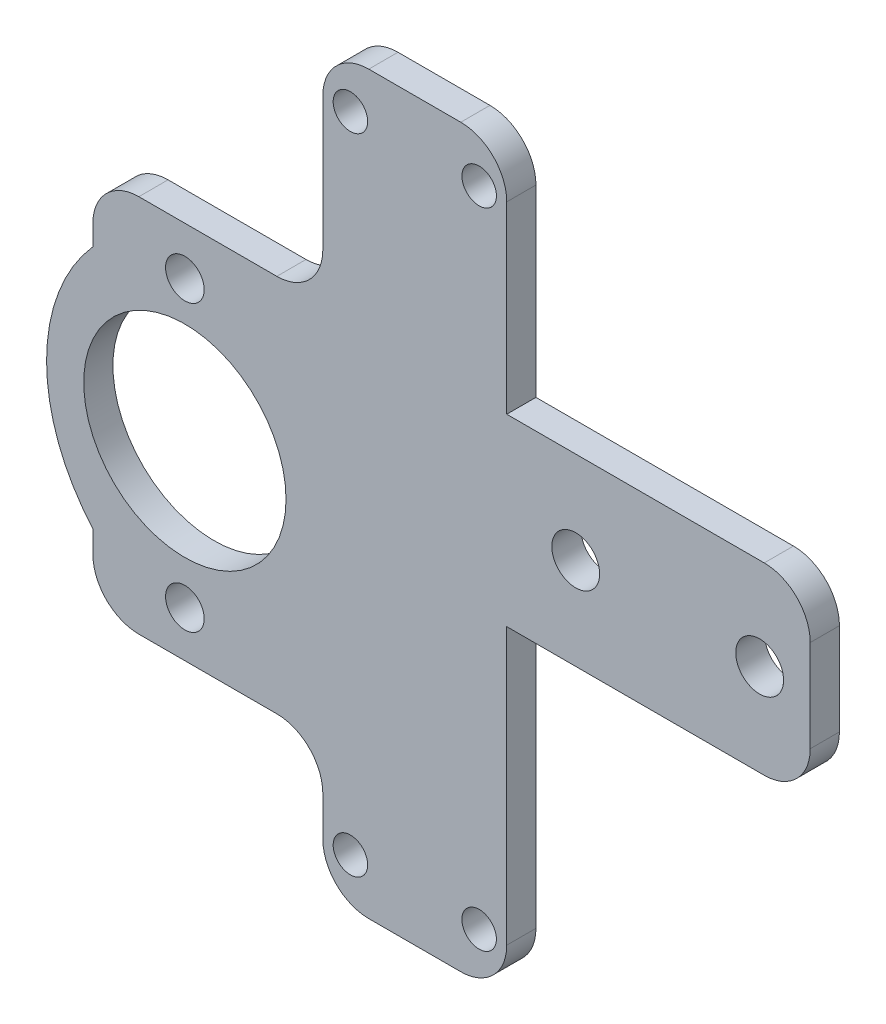
ISO-10303-21;
HEADER;
FILE_DESCRIPTION(('STEP AP214'),'2;1');
FILE_NAME('part.step','',(''),(''),'','','');
FILE_SCHEMA(('AUTOMOTIVE_DESIGN { 1 0 10303 214 1 1 1 1 }'));
ENDSEC;
DATA;
#1=APPLICATION_CONTEXT('core data for automotive mechanical design processes');
#2=APPLICATION_PROTOCOL_DEFINITION('international standard','automotive_design',2000,#1);
#3=PRODUCT_CONTEXT('',#1,'mechanical');
#4=PRODUCT('Part','Part','',(#3));
#5=PRODUCT_RELATED_PRODUCT_CATEGORY('part','',(#4));
#6=PRODUCT_DEFINITION_FORMATION('','',#4);
#7=PRODUCT_DEFINITION_CONTEXT('part definition',#1,'design');
#8=PRODUCT_DEFINITION('design','',#6,#7);
#9=PRODUCT_DEFINITION_SHAPE('','',#8);
#10=(LENGTH_UNIT() NAMED_UNIT(*) SI_UNIT(.MILLI.,.METRE.));
#11=(NAMED_UNIT(*) PLANE_ANGLE_UNIT() SI_UNIT($,.RADIAN.));
#12=(NAMED_UNIT(*) SI_UNIT($,.STERADIAN.) SOLID_ANGLE_UNIT());
#13=UNCERTAINTY_MEASURE_WITH_UNIT(LENGTH_MEASURE(1.E-05),#10,'distance_accuracy_value','');
#14=(GEOMETRIC_REPRESENTATION_CONTEXT(3) GLOBAL_UNCERTAINTY_ASSIGNED_CONTEXT((#13)) GLOBAL_UNIT_ASSIGNED_CONTEXT((#10,
#11,#12)) REPRESENTATION_CONTEXT('',''));
#15=CARTESIAN_POINT('',(0.,0.,0.));
#16=DIRECTION('',(0.,0.,1.));
#17=DIRECTION('',(1.,0.,0.));
#18=AXIS2_PLACEMENT_3D('',#15,#16,#17);
#19=CARTESIAN_POINT('',(-20.,50.4870000000071,3.175));
#20=DIRECTION('',(0.,0.,-1.));
#21=DIRECTION('',(-1.,0.,0.));
#22=AXIS2_PLACEMENT_3D('',#19,#20,#21);
#23=PLANE('',#22);
#24=CARTESIAN_POINT('',(-15.,35.,3.175));
#25=DIRECTION('',(0.,0.,1.));
#26=DIRECTION('',(1.,0.,0.));
#27=AXIS2_PLACEMENT_3D('',#24,#25,#26);
#28=CIRCLE('',#27,11.);
#29=CARTESIAN_POINT('',(-4.00000000000001,35.,3.175));
#30=VERTEX_POINT('',#29);
#31=EDGE_CURVE('E403',#30,#30,#28,.T.);
#32=ORIENTED_EDGE('',*,*,#31,.F.);
#33=EDGE_LOOP('',(#32));
#34=FACE_BOUND('',#33,.T.);
#35=CARTESIAN_POINT('',(-15.,19.2870000000071,3.175));
#36=DIRECTION('',(0.,0.,1.));
#37=DIRECTION('',(1.,0.,0.));
#38=AXIS2_PLACEMENT_3D('',#35,#36,#37);
#39=CIRCLE('',#38,2.09999999999999);
#40=CARTESIAN_POINT('',(-12.9,19.2870000000071,3.175));
#41=VERTEX_POINT('',#40);
#42=EDGE_CURVE('E405',#41,#41,#39,.T.);
#43=ORIENTED_EDGE('',*,*,#42,.F.);
#44=EDGE_LOOP('',(#43));
#45=FACE_BOUND('',#44,.T.);
#46=CARTESIAN_POINT('',(-15.,50.2750000000071,3.175));
#47=DIRECTION('',(0.,0.,1.));
#48=DIRECTION('',(1.,0.,0.));
#49=AXIS2_PLACEMENT_3D('',#46,#47,#48);
#50=CIRCLE('',#49,2.09999999999999);
#51=CARTESIAN_POINT('',(-12.9,50.2750000000071,3.175));
#52=VERTEX_POINT('',#51);
#53=EDGE_CURVE('E413',#52,#52,#50,.T.);
#54=ORIENTED_EDGE('',*,*,#53,.F.);
#55=EDGE_LOOP('',(#54));
#56=FACE_BOUND('',#55,.T.);
#57=CARTESIAN_POINT('',(27.5,45.,3.175));
#58=DIRECTION('',(0.,0.,1.));
#59=DIRECTION('',(1.,0.,0.));
#60=AXIS2_PLACEMENT_3D('',#57,#58,#59);
#61=CIRCLE('',#60,2.59999999999999);
#62=CARTESIAN_POINT('',(30.1,45.,3.175));
#63=VERTEX_POINT('',#62);
#64=EDGE_CURVE('E419',#63,#63,#61,.T.);
#65=ORIENTED_EDGE('',*,*,#64,.F.);
#66=EDGE_LOOP('',(#65));
#67=FACE_BOUND('',#66,.T.);
#68=CARTESIAN_POINT('',(47.5,45.,3.175));
#69=DIRECTION('',(0.,0.,1.));
#70=DIRECTION('',(1.,0.,0.));
#71=AXIS2_PLACEMENT_3D('',#68,#69,#70);
#72=CIRCLE('',#71,2.59999999999999);
#73=CARTESIAN_POINT('',(50.1,45.,3.175));
#74=VERTEX_POINT('',#73);
#75=EDGE_CURVE('E425',#74,#74,#72,.T.);
#76=ORIENTED_EDGE('',*,*,#75,.F.);
#77=EDGE_LOOP('',(#76));
#78=FACE_BOUND('',#77,.T.);
#79=CARTESIAN_POINT('',(17.,5.,3.175));
#80=DIRECTION('',(0.,0.,1.));
#81=DIRECTION('',(1.,0.,0.));
#82=AXIS2_PLACEMENT_3D('',#79,#80,#81);
#83=CIRCLE('',#82,1.87499999999999);
#84=CARTESIAN_POINT('',(18.875,5.,3.175));
#85=VERTEX_POINT('',#84);
#86=EDGE_CURVE('E431',#85,#85,#83,.T.);
#87=ORIENTED_EDGE('',*,*,#86,.F.);
#88=EDGE_LOOP('',(#87));
#89=FACE_BOUND('',#88,.T.);
#90=CARTESIAN_POINT('',(2.99999999999999,75.,3.175));
#91=DIRECTION('',(0.,0.,1.));
#92=DIRECTION('',(1.,0.,0.));
#93=AXIS2_PLACEMENT_3D('',#90,#91,#92);
#94=CIRCLE('',#93,1.87499999999999);
#95=CARTESIAN_POINT('',(4.87499999999998,75.,3.175));
#96=VERTEX_POINT('',#95);
#97=EDGE_CURVE('E437',#96,#96,#94,.T.);
#98=ORIENTED_EDGE('',*,*,#97,.F.);
#99=EDGE_LOOP('',(#98));
#100=FACE_BOUND('',#99,.T.);
#101=CARTESIAN_POINT('',(2.99999999999999,5.,3.175));
#102=DIRECTION('',(0.,0.,1.));
#103=DIRECTION('',(1.,0.,0.));
#104=AXIS2_PLACEMENT_3D('',#101,#102,#103);
#105=CIRCLE('',#104,1.87499999999999);
#106=CARTESIAN_POINT('',(4.87499999999998,5.,3.175));
#107=VERTEX_POINT('',#106);
#108=EDGE_CURVE('E443',#107,#107,#105,.T.);
#109=ORIENTED_EDGE('',*,*,#108,.F.);
#110=EDGE_LOOP('',(#109));
#111=FACE_BOUND('',#110,.T.);
#112=CARTESIAN_POINT('',(-20.,50.4870000000071,3.175));
#113=DIRECTION('',(0.,0.,-1.));
#114=DIRECTION('',(-1.,0.,0.));
#115=AXIS2_PLACEMENT_3D('',#112,#113,#114);
#116=CIRCLE('',#115,5.);
#117=CARTESIAN_POINT('',(-25.,50.4870000000071,3.175));
#118=VERTEX_POINT('',#117);
#119=CARTESIAN_POINT('',(-20.,55.4870000000071,3.175));
#120=VERTEX_POINT('',#119);
#121=EDGE_CURVE('E297',#118,#120,#116,.T.);
#122=ORIENTED_EDGE('',*,*,#121,.F.);
#123=DIRECTION('',(0.,1.,0.));
#124=VECTOR('',#123,1.);
#125=CARTESIAN_POINT('',(-25.,48.2715002124026,3.175));
#126=LINE('',#125,#124);
#127=CARTESIAN_POINT('',(-25.,48.2715002124026,3.175));
#128=VERTEX_POINT('',#127);
#129=EDGE_CURVE('E218',#128,#118,#126,.T.);
#130=ORIENTED_EDGE('',*,*,#129,.F.);
#131=CARTESIAN_POINT('',(-10.0378049032838,35.,3.175));
#132=DIRECTION('',(0.,0.,-1.));
#133=DIRECTION('',(-1.,0.,0.));
#134=AXIS2_PLACEMENT_3D('',#131,#132,#133);
#135=CIRCLE('',#134,20.);
#136=CARTESIAN_POINT('',(-25.,21.7284997875974,3.175));
#137=VERTEX_POINT('',#136);
#138=EDGE_CURVE('E203',#137,#128,#135,.T.);
#139=ORIENTED_EDGE('',*,*,#138,.F.);
#140=DIRECTION('',(0.,1.,0.));
#141=VECTOR('',#140,1.);
#142=CARTESIAN_POINT('',(-25.,19.2870000000071,3.175));
#143=LINE('',#142,#141);
#144=CARTESIAN_POINT('',(-25.,19.2870000000071,3.175));
#145=VERTEX_POINT('',#144);
#146=EDGE_CURVE('E216',#145,#137,#143,.T.);
#147=ORIENTED_EDGE('',*,*,#146,.F.);
#148=CARTESIAN_POINT('',(-20.,19.2870000000071,3.175));
#149=DIRECTION('',(0.,0.,-1.));
#150=DIRECTION('',(-1.,0.,0.));
#151=AXIS2_PLACEMENT_3D('',#148,#149,#150);
#152=CIRCLE('',#151,5.);
#153=CARTESIAN_POINT('',(-20.,14.2870000000071,3.175));
#154=VERTEX_POINT('',#153);
#155=EDGE_CURVE('E221',#154,#145,#152,.T.);
#156=ORIENTED_EDGE('',*,*,#155,.F.);
#157=DIRECTION('',(-1.,0.,0.));
#158=VECTOR('',#157,1.);
#159=CARTESIAN_POINT('',(-5.,14.2870000000071,3.175));
#160=LINE('',#159,#158);
#161=CARTESIAN_POINT('',(-5.,14.2870000000071,3.175));
#162=VERTEX_POINT('',#161);
#163=EDGE_CURVE('E223',#162,#154,#160,.T.);
#164=ORIENTED_EDGE('',*,*,#163,.F.);
#165=CARTESIAN_POINT('',(-5.,9.2870000000071,3.175));
#166=DIRECTION('',(0.,0.,1.));
#167=DIRECTION('',(1.,0.,0.));
#168=AXIS2_PLACEMENT_3D('',#165,#166,#167);
#169=CIRCLE('',#168,5.);
#170=CARTESIAN_POINT('',(0.,9.2870000000071,3.175));
#171=VERTEX_POINT('',#170);
#172=EDGE_CURVE('E505',#171,#162,#169,.T.);
#173=ORIENTED_EDGE('',*,*,#172,.F.);
#174=DIRECTION('',(0.,1.,0.));
#175=VECTOR('',#174,1.);
#176=CARTESIAN_POINT('',(0.,5.,3.175));
#177=LINE('',#176,#175);
#178=CARTESIAN_POINT('',(0.,5.,3.175));
#179=VERTEX_POINT('',#178);
#180=EDGE_CURVE('E502',#179,#171,#177,.T.);
#181=ORIENTED_EDGE('',*,*,#180,.F.);
#182=CARTESIAN_POINT('',(5.,5.,3.175));
#183=DIRECTION('',(0.,0.,-1.));
#184=DIRECTION('',(-1.,0.,0.));
#185=AXIS2_PLACEMENT_3D('',#182,#183,#184);
#186=CIRCLE('',#185,5.);
#187=CARTESIAN_POINT('',(5.,0.,3.175));
#188=VERTEX_POINT('',#187);
#189=EDGE_CURVE('E499',#188,#179,#186,.T.);
#190=ORIENTED_EDGE('',*,*,#189,.F.);
#191=DIRECTION('',(-1.,0.,0.));
#192=VECTOR('',#191,1.);
#193=CARTESIAN_POINT('',(15.,0.,3.175));
#194=LINE('',#193,#192);
#195=CARTESIAN_POINT('',(15.,0.,3.175));
#196=VERTEX_POINT('',#195);
#197=EDGE_CURVE('E496',#196,#188,#194,.T.);
#198=ORIENTED_EDGE('',*,*,#197,.F.);
#199=CARTESIAN_POINT('',(15.,5.,3.175));
#200=DIRECTION('',(0.,0.,-1.));
#201=DIRECTION('',(-1.,0.,0.));
#202=AXIS2_PLACEMENT_3D('',#199,#200,#201);
#203=CIRCLE('',#202,5.);
#204=CARTESIAN_POINT('',(20.,5.,3.175));
#205=VERTEX_POINT('',#204);
#206=EDGE_CURVE('E493',#205,#196,#203,.T.);
#207=ORIENTED_EDGE('',*,*,#206,.F.);
#208=DIRECTION('',(0.,-1.,0.));
#209=VECTOR('',#208,1.);
#210=CARTESIAN_POINT('',(20.,35.,3.175));
#211=LINE('',#210,#209);
#212=CARTESIAN_POINT('',(20.,35.,3.175));
#213=VERTEX_POINT('',#212);
#214=EDGE_CURVE('E490',#213,#205,#211,.T.);
#215=ORIENTED_EDGE('',*,*,#214,.F.);
#216=DIRECTION('',(-1.,0.,0.));
#217=VECTOR('',#216,1.);
#218=CARTESIAN_POINT('',(48.,35.,3.175));
#219=LINE('',#218,#217);
#220=CARTESIAN_POINT('',(48.,35.,3.175));
#221=VERTEX_POINT('',#220);
#222=EDGE_CURVE('E487',#221,#213,#219,.T.);
#223=ORIENTED_EDGE('',*,*,#222,.F.);
#224=CARTESIAN_POINT('',(48.,40.,3.175));
#225=DIRECTION('',(0.,0.,-1.));
#226=DIRECTION('',(-1.,0.,0.));
#227=AXIS2_PLACEMENT_3D('',#224,#225,#226);
#228=CIRCLE('',#227,4.99999999999999);
#229=CARTESIAN_POINT('',(53.,40.,3.175));
#230=VERTEX_POINT('',#229);
#231=EDGE_CURVE('E484',#230,#221,#228,.T.);
#232=ORIENTED_EDGE('',*,*,#231,.F.);
#233=DIRECTION('',(0.,-1.,0.));
#234=VECTOR('',#233,1.);
#235=CARTESIAN_POINT('',(53.,50.,3.175));
#236=LINE('',#235,#234);
#237=CARTESIAN_POINT('',(53.,50.,3.175));
#238=VERTEX_POINT('',#237);
#239=EDGE_CURVE('E481',#238,#230,#236,.T.);
#240=ORIENTED_EDGE('',*,*,#239,.F.);
#241=CARTESIAN_POINT('',(48.,50.,3.175));
#242=DIRECTION('',(0.,0.,-1.));
#243=DIRECTION('',(-1.,0.,0.));
#244=AXIS2_PLACEMENT_3D('',#241,#242,#243);
#245=CIRCLE('',#244,5.);
#246=CARTESIAN_POINT('',(48.,55.,3.175));
#247=VERTEX_POINT('',#246);
#248=EDGE_CURVE('E478',#247,#238,#245,.T.);
#249=ORIENTED_EDGE('',*,*,#248,.F.);
#250=DIRECTION('',(1.,0.,0.));
#251=VECTOR('',#250,1.);
#252=CARTESIAN_POINT('',(20.,55.,3.175));
#253=LINE('',#252,#251);
#254=CARTESIAN_POINT('',(20.,55.,3.175));
#255=VERTEX_POINT('',#254);
#256=EDGE_CURVE('E475',#255,#247,#253,.T.);
#257=ORIENTED_EDGE('',*,*,#256,.F.);
#258=DIRECTION('',(0.,-1.,0.));
#259=VECTOR('',#258,1.);
#260=CARTESIAN_POINT('',(20.,75.,3.175));
#261=LINE('',#260,#259);
#262=CARTESIAN_POINT('',(20.,75.,3.175));
#263=VERTEX_POINT('',#262);
#264=EDGE_CURVE('E472',#263,#255,#261,.T.);
#265=ORIENTED_EDGE('',*,*,#264,.F.);
#266=CARTESIAN_POINT('',(15.,75.,3.175));
#267=DIRECTION('',(0.,0.,-1.));
#268=DIRECTION('',(-1.,0.,0.));
#269=AXIS2_PLACEMENT_3D('',#266,#267,#268);
#270=CIRCLE('',#269,5.);
#271=CARTESIAN_POINT('',(15.,80.,3.175));
#272=VERTEX_POINT('',#271);
#273=EDGE_CURVE('E469',#272,#263,#270,.T.);
#274=ORIENTED_EDGE('',*,*,#273,.F.);
#275=DIRECTION('',(1.,0.,0.));
#276=VECTOR('',#275,1.);
#277=CARTESIAN_POINT('',(5.,80.,3.175));
#278=LINE('',#277,#276);
#279=CARTESIAN_POINT('',(5.,80.,3.175));
#280=VERTEX_POINT('',#279);
#281=EDGE_CURVE('E466',#280,#272,#278,.T.);
#282=ORIENTED_EDGE('',*,*,#281,.F.);
#283=CARTESIAN_POINT('',(5.,75.,3.175));
#284=DIRECTION('',(0.,0.,-1.));
#285=DIRECTION('',(-1.,0.,0.));
#286=AXIS2_PLACEMENT_3D('',#283,#284,#285);
#287=CIRCLE('',#286,5.);
#288=CARTESIAN_POINT('',(0.,75.,3.175));
#289=VERTEX_POINT('',#288);
#290=EDGE_CURVE('E463',#289,#280,#287,.T.);
#291=ORIENTED_EDGE('',*,*,#290,.F.);
#292=DIRECTION('',(0.,1.,0.));
#293=VECTOR('',#292,1.);
#294=CARTESIAN_POINT('',(0.,60.4870000000071,3.175));
#295=LINE('',#294,#293);
#296=CARTESIAN_POINT('',(0.,60.4870000000071,3.175));
#297=VERTEX_POINT('',#296);
#298=EDGE_CURVE('E460',#297,#289,#295,.T.);
#299=ORIENTED_EDGE('',*,*,#298,.F.);
#300=CARTESIAN_POINT('',(-5.,60.4870000000071,3.175));
#301=DIRECTION('',(0.,0.,1.));
#302=DIRECTION('',(1.,0.,0.));
#303=AXIS2_PLACEMENT_3D('',#300,#301,#302);
#304=CIRCLE('',#303,5.);
#305=CARTESIAN_POINT('',(-5.,55.4870000000071,3.175));
#306=VERTEX_POINT('',#305);
#307=EDGE_CURVE('E457',#306,#297,#304,.T.);
#308=ORIENTED_EDGE('',*,*,#307,.F.);
#309=DIRECTION('',(1.,0.,0.));
#310=VECTOR('',#309,1.);
#311=CARTESIAN_POINT('',(-20.,55.4870000000071,3.175));
#312=LINE('',#311,#310);
#313=EDGE_CURVE('E455',#120,#306,#312,.T.);
#314=ORIENTED_EDGE('',*,*,#313,.F.);
#315=EDGE_LOOP('',(#122,#130,#139,#147,#156,#164,#173,#181,#190,#198,#207,#215,#223,#232,#240,
#249,#257,#265,#274,#282,#291,#299,#308,#314));
#316=FACE_BOUND('',#315,.T.);
#317=CARTESIAN_POINT('',(17.,75.,3.175));
#318=DIRECTION('',(0.,0.,1.));
#319=DIRECTION('',(1.,0.,0.));
#320=AXIS2_PLACEMENT_3D('',#317,#318,#319);
#321=CIRCLE('',#320,1.87499999999999);
#322=CARTESIAN_POINT('',(18.875,75.,3.175));
#323=VERTEX_POINT('',#322);
#324=EDGE_CURVE('E449',#323,#323,#321,.T.);
#325=ORIENTED_EDGE('',*,*,#324,.F.);
#326=EDGE_LOOP('',(#325));
#327=FACE_BOUND('',#326,.T.);
#328=ADVANCED_FACE('F34',(#34,#45,#56,#67,#78,#89,#100,#111,#316,#327),#23,.F.);
#329=CARTESIAN_POINT('',(-20.,50.4870000000071,0.));
#330=DIRECTION('',(0.,0.,-1.));
#331=DIRECTION('',(-1.,0.,0.));
#332=AXIS2_PLACEMENT_3D('',#329,#330,#331);
#333=PLANE('',#332);
#334=CARTESIAN_POINT('',(-15.,35.,0.));
#335=DIRECTION('',(0.,0.,1.));
#336=DIRECTION('',(1.,0.,0.));
#337=AXIS2_PLACEMENT_3D('',#334,#335,#336);
#338=CIRCLE('',#337,11.);
#339=CARTESIAN_POINT('',(-4.00000000000001,35.,0.));
#340=VERTEX_POINT('',#339);
#341=EDGE_CURVE('E401',#340,#340,#338,.T.);
#342=ORIENTED_EDGE('',*,*,#341,.T.);
#343=EDGE_LOOP('',(#342));
#344=FACE_BOUND('',#343,.T.);
#345=CARTESIAN_POINT('',(-15.,19.2870000000071,0.));
#346=DIRECTION('',(0.,0.,1.));
#347=DIRECTION('',(1.,0.,0.));
#348=AXIS2_PLACEMENT_3D('',#345,#346,#347);
#349=CIRCLE('',#348,2.09999999999999);
#350=CARTESIAN_POINT('',(-12.9,19.2870000000071,0.));
#351=VERTEX_POINT('',#350);
#352=EDGE_CURVE('E410',#351,#351,#349,.T.);
#353=ORIENTED_EDGE('',*,*,#352,.T.);
#354=EDGE_LOOP('',(#353));
#355=FACE_BOUND('',#354,.T.);
#356=CARTESIAN_POINT('',(-15.,50.2750000000071,0.));
#357=DIRECTION('',(0.,0.,1.));
#358=DIRECTION('',(1.,0.,0.));
#359=AXIS2_PLACEMENT_3D('',#356,#357,#358);
#360=CIRCLE('',#359,2.09999999999999);
#361=CARTESIAN_POINT('',(-12.9,50.2750000000071,0.));
#362=VERTEX_POINT('',#361);
#363=EDGE_CURVE('E416',#362,#362,#360,.T.);
#364=ORIENTED_EDGE('',*,*,#363,.T.);
#365=EDGE_LOOP('',(#364));
#366=FACE_BOUND('',#365,.T.);
#367=CARTESIAN_POINT('',(27.5,45.,0.));
#368=DIRECTION('',(0.,0.,1.));
#369=DIRECTION('',(1.,0.,0.));
#370=AXIS2_PLACEMENT_3D('',#367,#368,#369);
#371=CIRCLE('',#370,2.59999999999999);
#372=CARTESIAN_POINT('',(30.1,45.,0.));
#373=VERTEX_POINT('',#372);
#374=EDGE_CURVE('E422',#373,#373,#371,.T.);
#375=ORIENTED_EDGE('',*,*,#374,.T.);
#376=EDGE_LOOP('',(#375));
#377=FACE_BOUND('',#376,.T.);
#378=CARTESIAN_POINT('',(47.5,45.,0.));
#379=DIRECTION('',(0.,0.,1.));
#380=DIRECTION('',(1.,0.,0.));
#381=AXIS2_PLACEMENT_3D('',#378,#379,#380);
#382=CIRCLE('',#381,2.59999999999999);
#383=CARTESIAN_POINT('',(50.1,45.,0.));
#384=VERTEX_POINT('',#383);
#385=EDGE_CURVE('E428',#384,#384,#382,.T.);
#386=ORIENTED_EDGE('',*,*,#385,.T.);
#387=EDGE_LOOP('',(#386));
#388=FACE_BOUND('',#387,.T.);
#389=CARTESIAN_POINT('',(17.,5.,0.));
#390=DIRECTION('',(0.,0.,1.));
#391=DIRECTION('',(1.,0.,0.));
#392=AXIS2_PLACEMENT_3D('',#389,#390,#391);
#393=CIRCLE('',#392,1.87499999999999);
#394=CARTESIAN_POINT('',(18.875,5.,0.));
#395=VERTEX_POINT('',#394);
#396=EDGE_CURVE('E434',#395,#395,#393,.T.);
#397=ORIENTED_EDGE('',*,*,#396,.T.);
#398=EDGE_LOOP('',(#397));
#399=FACE_BOUND('',#398,.T.);
#400=CARTESIAN_POINT('',(2.99999999999999,75.,0.));
#401=DIRECTION('',(0.,0.,1.));
#402=DIRECTION('',(1.,0.,0.));
#403=AXIS2_PLACEMENT_3D('',#400,#401,#402);
#404=CIRCLE('',#403,1.87499999999999);
#405=CARTESIAN_POINT('',(4.87499999999998,75.,0.));
#406=VERTEX_POINT('',#405);
#407=EDGE_CURVE('E440',#406,#406,#404,.T.);
#408=ORIENTED_EDGE('',*,*,#407,.T.);
#409=EDGE_LOOP('',(#408));
#410=FACE_BOUND('',#409,.T.);
#411=CARTESIAN_POINT('',(2.99999999999999,5.,0.));
#412=DIRECTION('',(0.,0.,1.));
#413=DIRECTION('',(1.,0.,0.));
#414=AXIS2_PLACEMENT_3D('',#411,#412,#413);
#415=CIRCLE('',#414,1.87499999999999);
#416=CARTESIAN_POINT('',(4.87499999999998,5.,0.));
#417=VERTEX_POINT('',#416);
#418=EDGE_CURVE('E446',#417,#417,#415,.T.);
#419=ORIENTED_EDGE('',*,*,#418,.T.);
#420=EDGE_LOOP('',(#419));
#421=FACE_BOUND('',#420,.T.);
#422=CARTESIAN_POINT('',(-20.,50.4870000000071,0.));
#423=DIRECTION('',(0.,0.,-1.));
#424=DIRECTION('',(-1.,0.,0.));
#425=AXIS2_PLACEMENT_3D('',#422,#423,#424);
#426=CIRCLE('',#425,5.);
#427=CARTESIAN_POINT('',(-25.,50.4870000000071,0.));
#428=VERTEX_POINT('',#427);
#429=CARTESIAN_POINT('',(-20.,55.4870000000071,0.));
#430=VERTEX_POINT('',#429);
#431=EDGE_CURVE('E228',#428,#430,#426,.T.);
#432=ORIENTED_EDGE('',*,*,#431,.T.);
#433=DIRECTION('',(1.,0.,0.));
#434=VECTOR('',#433,1.);
#435=CARTESIAN_POINT('',(-20.,55.4870000000071,0.));
#436=LINE('',#435,#434);
#437=CARTESIAN_POINT('',(-5.,55.4870000000071,0.));
#438=VERTEX_POINT('',#437);
#439=EDGE_CURVE('E231',#430,#438,#436,.T.);
#440=ORIENTED_EDGE('',*,*,#439,.T.);
#441=CARTESIAN_POINT('',(-5.,60.4870000000071,0.));
#442=DIRECTION('',(0.,0.,1.));
#443=DIRECTION('',(1.,0.,0.));
#444=AXIS2_PLACEMENT_3D('',#441,#442,#443);
#445=CIRCLE('',#444,5.);
#446=CARTESIAN_POINT('',(0.,60.4870000000071,0.));
#447=VERTEX_POINT('',#446);
#448=EDGE_CURVE('E235',#438,#447,#445,.T.);
#449=ORIENTED_EDGE('',*,*,#448,.T.);
#450=DIRECTION('',(0.,1.,0.));
#451=VECTOR('',#450,1.);
#452=CARTESIAN_POINT('',(0.,60.4870000000071,0.));
#453=LINE('',#452,#451);
#454=CARTESIAN_POINT('',(0.,75.,0.));
#455=VERTEX_POINT('',#454);
#456=EDGE_CURVE('E238',#447,#455,#453,.T.);
#457=ORIENTED_EDGE('',*,*,#456,.T.);
#458=CARTESIAN_POINT('',(5.,75.,0.));
#459=DIRECTION('',(0.,0.,-1.));
#460=DIRECTION('',(-1.,0.,0.));
#461=AXIS2_PLACEMENT_3D('',#458,#459,#460);
#462=CIRCLE('',#461,5.);
#463=CARTESIAN_POINT('',(5.,80.,0.));
#464=VERTEX_POINT('',#463);
#465=EDGE_CURVE('E241',#455,#464,#462,.T.);
#466=ORIENTED_EDGE('',*,*,#465,.T.);
#467=DIRECTION('',(1.,0.,0.));
#468=VECTOR('',#467,1.);
#469=CARTESIAN_POINT('',(5.,80.,0.));
#470=LINE('',#469,#468);
#471=CARTESIAN_POINT('',(15.,80.,0.));
#472=VERTEX_POINT('',#471);
#473=EDGE_CURVE('E244',#464,#472,#470,.T.);
#474=ORIENTED_EDGE('',*,*,#473,.T.);
#475=CARTESIAN_POINT('',(15.,75.,0.));
#476=DIRECTION('',(0.,0.,-1.));
#477=DIRECTION('',(-1.,0.,0.));
#478=AXIS2_PLACEMENT_3D('',#475,#476,#477);
#479=CIRCLE('',#478,5.);
#480=CARTESIAN_POINT('',(20.,75.,0.));
#481=VERTEX_POINT('',#480);
#482=EDGE_CURVE('E247',#472,#481,#479,.T.);
#483=ORIENTED_EDGE('',*,*,#482,.T.);
#484=DIRECTION('',(0.,-1.,0.));
#485=VECTOR('',#484,1.);
#486=CARTESIAN_POINT('',(20.,75.,0.));
#487=LINE('',#486,#485);
#488=CARTESIAN_POINT('',(20.,55.,0.));
#489=VERTEX_POINT('',#488);
#490=EDGE_CURVE('E250',#481,#489,#487,.T.);
#491=ORIENTED_EDGE('',*,*,#490,.T.);
#492=DIRECTION('',(1.,0.,0.));
#493=VECTOR('',#492,1.);
#494=CARTESIAN_POINT('',(20.,55.,0.));
#495=LINE('',#494,#493);
#496=CARTESIAN_POINT('',(48.,55.,0.));
#497=VERTEX_POINT('',#496);
#498=EDGE_CURVE('E253',#489,#497,#495,.T.);
#499=ORIENTED_EDGE('',*,*,#498,.T.);
#500=CARTESIAN_POINT('',(48.,50.,0.));
#501=DIRECTION('',(0.,0.,-1.));
#502=DIRECTION('',(-1.,0.,0.));
#503=AXIS2_PLACEMENT_3D('',#500,#501,#502);
#504=CIRCLE('',#503,5.);
#505=CARTESIAN_POINT('',(53.,50.,0.));
#506=VERTEX_POINT('',#505);
#507=EDGE_CURVE('E256',#497,#506,#504,.T.);
#508=ORIENTED_EDGE('',*,*,#507,.T.);
#509=DIRECTION('',(0.,-1.,0.));
#510=VECTOR('',#509,1.);
#511=CARTESIAN_POINT('',(53.,50.,0.));
#512=LINE('',#511,#510);
#513=CARTESIAN_POINT('',(53.,40.,0.));
#514=VERTEX_POINT('',#513);
#515=EDGE_CURVE('E259',#506,#514,#512,.T.);
#516=ORIENTED_EDGE('',*,*,#515,.T.);
#517=CARTESIAN_POINT('',(48.,40.,0.));
#518=DIRECTION('',(0.,0.,-1.));
#519=DIRECTION('',(-1.,0.,0.));
#520=AXIS2_PLACEMENT_3D('',#517,#518,#519);
#521=CIRCLE('',#520,4.99999999999999);
#522=CARTESIAN_POINT('',(48.,35.,0.));
#523=VERTEX_POINT('',#522);
#524=EDGE_CURVE('E262',#514,#523,#521,.T.);
#525=ORIENTED_EDGE('',*,*,#524,.T.);
#526=DIRECTION('',(-1.,0.,0.));
#527=VECTOR('',#526,1.);
#528=CARTESIAN_POINT('',(48.,35.,0.));
#529=LINE('',#528,#527);
#530=CARTESIAN_POINT('',(20.,35.,0.));
#531=VERTEX_POINT('',#530);
#532=EDGE_CURVE('E265',#523,#531,#529,.T.);
#533=ORIENTED_EDGE('',*,*,#532,.T.);
#534=DIRECTION('',(0.,-1.,0.));
#535=VECTOR('',#534,1.);
#536=CARTESIAN_POINT('',(20.,35.,0.));
#537=LINE('',#536,#535);
#538=CARTESIAN_POINT('',(20.,5.,0.));
#539=VERTEX_POINT('',#538);
#540=EDGE_CURVE('E268',#531,#539,#537,.T.);
#541=ORIENTED_EDGE('',*,*,#540,.T.);
#542=CARTESIAN_POINT('',(15.,5.,0.));
#543=DIRECTION('',(0.,0.,-1.));
#544=DIRECTION('',(-1.,0.,0.));
#545=AXIS2_PLACEMENT_3D('',#542,#543,#544);
#546=CIRCLE('',#545,5.);
#547=CARTESIAN_POINT('',(15.,0.,0.));
#548=VERTEX_POINT('',#547);
#549=EDGE_CURVE('E271',#539,#548,#546,.T.);
#550=ORIENTED_EDGE('',*,*,#549,.T.);
#551=DIRECTION('',(-1.,0.,0.));
#552=VECTOR('',#551,1.);
#553=CARTESIAN_POINT('',(15.,0.,0.));
#554=LINE('',#553,#552);
#555=CARTESIAN_POINT('',(5.,0.,0.));
#556=VERTEX_POINT('',#555);
#557=EDGE_CURVE('E274',#548,#556,#554,.T.);
#558=ORIENTED_EDGE('',*,*,#557,.T.);
#559=CARTESIAN_POINT('',(5.,5.,0.));
#560=DIRECTION('',(0.,0.,-1.));
#561=DIRECTION('',(-1.,0.,0.));
#562=AXIS2_PLACEMENT_3D('',#559,#560,#561);
#563=CIRCLE('',#562,5.);
#564=CARTESIAN_POINT('',(0.,5.,0.));
#565=VERTEX_POINT('',#564);
#566=EDGE_CURVE('E277',#556,#565,#563,.T.);
#567=ORIENTED_EDGE('',*,*,#566,.T.);
#568=DIRECTION('',(0.,1.,0.));
#569=VECTOR('',#568,1.);
#570=CARTESIAN_POINT('',(0.,5.,0.));
#571=LINE('',#570,#569);
#572=CARTESIAN_POINT('',(0.,9.2870000000071,0.));
#573=VERTEX_POINT('',#572);
#574=EDGE_CURVE('E280',#565,#573,#571,.T.);
#575=ORIENTED_EDGE('',*,*,#574,.T.);
#576=CARTESIAN_POINT('',(-5.,9.2870000000071,0.));
#577=DIRECTION('',(0.,0.,1.));
#578=DIRECTION('',(1.,0.,0.));
#579=AXIS2_PLACEMENT_3D('',#576,#577,#578);
#580=CIRCLE('',#579,5.);
#581=CARTESIAN_POINT('',(-5.,14.2870000000071,0.));
#582=VERTEX_POINT('',#581);
#583=EDGE_CURVE('E283',#573,#582,#580,.T.);
#584=ORIENTED_EDGE('',*,*,#583,.T.);
#585=DIRECTION('',(-1.,0.,0.));
#586=VECTOR('',#585,1.);
#587=CARTESIAN_POINT('',(-5.,14.2870000000071,0.));
#588=LINE('',#587,#586);
#589=CARTESIAN_POINT('',(-20.,14.2870000000071,0.));
#590=VERTEX_POINT('',#589);
#591=EDGE_CURVE('E286',#582,#590,#588,.T.);
#592=ORIENTED_EDGE('',*,*,#591,.T.);
#593=CARTESIAN_POINT('',(-20.,19.2870000000071,0.));
#594=DIRECTION('',(0.,0.,-1.));
#595=DIRECTION('',(-1.,0.,0.));
#596=AXIS2_PLACEMENT_3D('',#593,#594,#595);
#597=CIRCLE('',#596,5.);
#598=CARTESIAN_POINT('',(-25.,19.2870000000071,0.));
#599=VERTEX_POINT('',#598);
#600=EDGE_CURVE('E289',#590,#599,#597,.T.);
#601=ORIENTED_EDGE('',*,*,#600,.T.);
#602=DIRECTION('',(0.,1.,0.));
#603=VECTOR('',#602,1.);
#604=CARTESIAN_POINT('',(-25.,19.2870000000071,0.));
#605=LINE('',#604,#603);
#606=CARTESIAN_POINT('',(-25.,21.7284997875974,0.));
#607=VERTEX_POINT('',#606);
#608=EDGE_CURVE('E292',#599,#607,#605,.T.);
#609=ORIENTED_EDGE('',*,*,#608,.T.);
#610=CARTESIAN_POINT('',(-10.0378049032838,35.,0.));
#611=DIRECTION('',(0.,0.,-1.));
#612=DIRECTION('',(-1.,0.,0.));
#613=AXIS2_PLACEMENT_3D('',#610,#611,#612);
#614=CIRCLE('',#613,20.);
#615=CARTESIAN_POINT('',(-25.,48.2715002124026,0.));
#616=VERTEX_POINT('',#615);
#617=EDGE_CURVE('E205',#607,#616,#614,.T.);
#618=ORIENTED_EDGE('',*,*,#617,.T.);
#619=DIRECTION('',(0.,1.,0.));
#620=VECTOR('',#619,1.);
#621=CARTESIAN_POINT('',(-25.,48.2715002124026,0.));
#622=LINE('',#621,#620);
#623=EDGE_CURVE('E295',#616,#428,#622,.T.);
#624=ORIENTED_EDGE('',*,*,#623,.T.);
#625=EDGE_LOOP('',(#432,#440,#449,#457,#466,#474,#483,#491,#499,#508,#516,#525,#533,#541,#550,
#558,#567,#575,#584,#592,#601,#609,#618,#624));
#626=FACE_BOUND('',#625,.T.);
#627=CARTESIAN_POINT('',(17.,75.,0.));
#628=DIRECTION('',(0.,0.,1.));
#629=DIRECTION('',(1.,0.,0.));
#630=AXIS2_PLACEMENT_3D('',#627,#628,#629);
#631=CIRCLE('',#630,1.87499999999999);
#632=CARTESIAN_POINT('',(18.875,75.,0.));
#633=VERTEX_POINT('',#632);
#634=EDGE_CURVE('E232',#633,#633,#631,.T.);
#635=ORIENTED_EDGE('',*,*,#634,.T.);
#636=EDGE_LOOP('',(#635));
#637=FACE_BOUND('',#636,.T.);
#638=ADVANCED_FACE('F340',(#344,#355,#366,#377,#388,#399,#410,#421,#626,#637),#333,.T.);
#639=CARTESIAN_POINT('',(-20.,50.4870000000071,3.175));
#640=DIRECTION('',(0.,0.,-1.));
#641=DIRECTION('',(-1.,0.,0.));
#642=AXIS2_PLACEMENT_3D('',#639,#640,#641);
#643=CYLINDRICAL_SURFACE('',#642,5.);
#644=ORIENTED_EDGE('',*,*,#431,.F.);
#645=DIRECTION('',(0.,0.,-1.));
#646=VECTOR('',#645,1.);
#647=CARTESIAN_POINT('',(-25.,50.4870000000071,3.175));
#648=LINE('',#647,#646);
#649=EDGE_CURVE('E11',#118,#428,#648,.T.);
#650=ORIENTED_EDGE('',*,*,#649,.F.);
#651=ORIENTED_EDGE('',*,*,#121,.T.);
#652=DIRECTION('',(0.,0.,-1.));
#653=VECTOR('',#652,1.);
#654=CARTESIAN_POINT('',(-20.,55.4870000000071,3.175));
#655=LINE('',#654,#653);
#656=EDGE_CURVE('E38',#120,#430,#655,.T.);
#657=ORIENTED_EDGE('',*,*,#656,.T.);
#658=EDGE_LOOP('',(#644,#650,#651,#657));
#659=FACE_BOUND('',#658,.T.);
#660=ADVANCED_FACE('F36',(#659),#643,.T.);
#661=CARTESIAN_POINT('',(-25.,48.2715002124026,3.175));
#662=DIRECTION('',(-1.,0.,0.));
#663=DIRECTION('',(0.,-1.,0.));
#664=AXIS2_PLACEMENT_3D('',#661,#662,#663);
#665=PLANE('',#664);
#666=ORIENTED_EDGE('',*,*,#623,.F.);
#667=DIRECTION('',(0.,0.,-1.));
#668=VECTOR('',#667,1.);
#669=CARTESIAN_POINT('',(-25.,48.2715002124026,3.175));
#670=LINE('',#669,#668);
#671=EDGE_CURVE('E44',#128,#616,#670,.T.);
#672=ORIENTED_EDGE('',*,*,#671,.F.);
#673=ORIENTED_EDGE('',*,*,#129,.T.);
#674=ORIENTED_EDGE('',*,*,#649,.T.);
#675=EDGE_LOOP('',(#666,#672,#673,#674));
#676=FACE_BOUND('',#675,.T.);
#677=ADVANCED_FACE('F342',(#676),#665,.T.);
#678=CARTESIAN_POINT('',(-10.0378049032838,35.,3.175));
#679=DIRECTION('',(0.,0.,-1.));
#680=DIRECTION('',(-1.,0.,0.));
#681=AXIS2_PLACEMENT_3D('',#678,#679,#680);
#682=CYLINDRICAL_SURFACE('',#681,20.);
#683=ORIENTED_EDGE('',*,*,#617,.F.);
#684=DIRECTION('',(0.,0.,-1.));
#685=VECTOR('',#684,1.);
#686=CARTESIAN_POINT('',(-25.,21.7284997875974,3.175));
#687=LINE('',#686,#685);
#688=EDGE_CURVE('E200',#137,#607,#687,.T.);
#689=ORIENTED_EDGE('',*,*,#688,.F.);
#690=ORIENTED_EDGE('',*,*,#138,.T.);
#691=ORIENTED_EDGE('',*,*,#671,.T.);
#692=EDGE_LOOP('',(#683,#689,#690,#691));
#693=FACE_BOUND('',#692,.T.);
#694=ADVANCED_FACE('F202',(#693),#682,.T.);
#695=CARTESIAN_POINT('',(-25.,19.2870000000071,3.175));
#696=DIRECTION('',(-1.,0.,0.));
#697=DIRECTION('',(0.,0.,1.));
#698=AXIS2_PLACEMENT_3D('',#695,#696,#697);
#699=PLANE('',#698);
#700=ORIENTED_EDGE('',*,*,#608,.F.);
#701=DIRECTION('',(0.,0.,-1.));
#702=VECTOR('',#701,1.);
#703=CARTESIAN_POINT('',(-25.,19.2870000000071,3.175));
#704=LINE('',#703,#702);
#705=EDGE_CURVE('E210',#145,#599,#704,.T.);
#706=ORIENTED_EDGE('',*,*,#705,.F.);
#707=ORIENTED_EDGE('',*,*,#146,.T.);
#708=ORIENTED_EDGE('',*,*,#688,.T.);
#709=EDGE_LOOP('',(#700,#706,#707,#708));
#710=FACE_BOUND('',#709,.T.);
#711=ADVANCED_FACE('F220',(#710),#699,.T.);
#712=CARTESIAN_POINT('',(-20.,19.2870000000071,3.175));
#713=DIRECTION('',(0.,0.,-1.));
#714=DIRECTION('',(-1.,0.,0.));
#715=AXIS2_PLACEMENT_3D('',#712,#713,#714);
#716=CYLINDRICAL_SURFACE('',#715,5.);
#717=ORIENTED_EDGE('',*,*,#600,.F.);
#718=DIRECTION('',(0.,0.,-1.));
#719=VECTOR('',#718,1.);
#720=CARTESIAN_POINT('',(-20.,14.2870000000071,3.175));
#721=LINE('',#720,#719);
#722=EDGE_CURVE('E301',#154,#590,#721,.T.);
#723=ORIENTED_EDGE('',*,*,#722,.F.);
#724=ORIENTED_EDGE('',*,*,#155,.T.);
#725=ORIENTED_EDGE('',*,*,#705,.T.);
#726=EDGE_LOOP('',(#717,#723,#724,#725));
#727=FACE_BOUND('',#726,.T.);
#728=ADVANCED_FACE('F581',(#727),#716,.T.);
#729=CARTESIAN_POINT('',(-5.,14.2870000000071,3.175));
#730=DIRECTION('',(0.,-1.,0.));
#731=DIRECTION('',(1.,0.,0.));
#732=AXIS2_PLACEMENT_3D('',#729,#730,#731);
#733=PLANE('',#732);
#734=ORIENTED_EDGE('',*,*,#591,.F.);
#735=DIRECTION('',(0.,0.,-1.));
#736=VECTOR('',#735,1.);
#737=CARTESIAN_POINT('',(-5.,14.2870000000071,3.175));
#738=LINE('',#737,#736);
#739=EDGE_CURVE('E303',#162,#582,#738,.T.);
#740=ORIENTED_EDGE('',*,*,#739,.F.);
#741=ORIENTED_EDGE('',*,*,#163,.T.);
#742=ORIENTED_EDGE('',*,*,#722,.T.);
#743=EDGE_LOOP('',(#734,#740,#741,#742));
#744=FACE_BOUND('',#743,.T.);
#745=ADVANCED_FACE('F511',(#744),#733,.T.);
#746=CARTESIAN_POINT('',(-5.,9.2870000000071,3.175));
#747=DIRECTION('',(0.,0.,-1.));
#748=DIRECTION('',(-1.,0.,0.));
#749=AXIS2_PLACEMENT_3D('',#746,#747,#748);
#750=CYLINDRICAL_SURFACE('',#749,5.);
#751=ORIENTED_EDGE('',*,*,#583,.F.);
#752=DIRECTION('',(0.,0.,-1.));
#753=VECTOR('',#752,1.);
#754=CARTESIAN_POINT('',(0.,9.2870000000071,3.175));
#755=LINE('',#754,#753);
#756=EDGE_CURVE('E305',#171,#573,#755,.T.);
#757=ORIENTED_EDGE('',*,*,#756,.F.);
#758=ORIENTED_EDGE('',*,*,#172,.T.);
#759=ORIENTED_EDGE('',*,*,#739,.T.);
#760=EDGE_LOOP('',(#751,#757,#758,#759));
#761=FACE_BOUND('',#760,.T.);
#762=ADVANCED_FACE('F517',(#761),#750,.F.);
#763=CARTESIAN_POINT('',(0.,5.,3.175));
#764=DIRECTION('',(-1.,0.,0.));
#765=DIRECTION('',(0.,0.,1.));
#766=AXIS2_PLACEMENT_3D('',#763,#764,#765);
#767=PLANE('',#766);
#768=ORIENTED_EDGE('',*,*,#574,.F.);
#769=DIRECTION('',(0.,0.,-1.));
#770=VECTOR('',#769,1.);
#771=CARTESIAN_POINT('',(0.,5.,3.175));
#772=LINE('',#771,#770);
#773=EDGE_CURVE('E307',#179,#565,#772,.T.);
#774=ORIENTED_EDGE('',*,*,#773,.F.);
#775=ORIENTED_EDGE('',*,*,#180,.T.);
#776=ORIENTED_EDGE('',*,*,#756,.T.);
#777=EDGE_LOOP('',(#768,#774,#775,#776));
#778=FACE_BOUND('',#777,.T.);
#779=ADVANCED_FACE('F520',(#778),#767,.T.);
#780=CARTESIAN_POINT('',(5.,5.,3.175));
#781=DIRECTION('',(0.,0.,-1.));
#782=DIRECTION('',(-1.,0.,0.));
#783=AXIS2_PLACEMENT_3D('',#780,#781,#782);
#784=CYLINDRICAL_SURFACE('',#783,5.);
#785=ORIENTED_EDGE('',*,*,#566,.F.);
#786=DIRECTION('',(0.,0.,-1.));
#787=VECTOR('',#786,1.);
#788=CARTESIAN_POINT('',(5.,0.,3.175));
#789=LINE('',#788,#787);
#790=EDGE_CURVE('E309',#188,#556,#789,.T.);
#791=ORIENTED_EDGE('',*,*,#790,.F.);
#792=ORIENTED_EDGE('',*,*,#189,.T.);
#793=ORIENTED_EDGE('',*,*,#773,.T.);
#794=EDGE_LOOP('',(#785,#791,#792,#793));
#795=FACE_BOUND('',#794,.T.);
#796=ADVANCED_FACE('F525',(#795),#784,.T.);
#797=CARTESIAN_POINT('',(15.,0.,3.175));
#798=DIRECTION('',(0.,-1.,0.));
#799=DIRECTION('',(0.,0.,-1.));
#800=AXIS2_PLACEMENT_3D('',#797,#798,#799);
#801=PLANE('',#800);
#802=ORIENTED_EDGE('',*,*,#557,.F.);
#803=DIRECTION('',(0.,0.,-1.));
#804=VECTOR('',#803,1.);
#805=CARTESIAN_POINT('',(15.,0.,3.175));
#806=LINE('',#805,#804);
#807=EDGE_CURVE('E311',#196,#548,#806,.T.);
#808=ORIENTED_EDGE('',*,*,#807,.F.);
#809=ORIENTED_EDGE('',*,*,#197,.T.);
#810=ORIENTED_EDGE('',*,*,#790,.T.);
#811=EDGE_LOOP('',(#802,#808,#809,#810));
#812=FACE_BOUND('',#811,.T.);
#813=ADVANCED_FACE('F528',(#812),#801,.T.);
#814=CARTESIAN_POINT('',(15.,5.,3.175));
#815=DIRECTION('',(0.,0.,-1.));
#816=DIRECTION('',(-1.,0.,0.));
#817=AXIS2_PLACEMENT_3D('',#814,#815,#816);
#818=CYLINDRICAL_SURFACE('',#817,5.);
#819=ORIENTED_EDGE('',*,*,#549,.F.);
#820=DIRECTION('',(0.,0.,-1.));
#821=VECTOR('',#820,1.);
#822=CARTESIAN_POINT('',(20.,5.,3.175));
#823=LINE('',#822,#821);
#824=EDGE_CURVE('E313',#205,#539,#823,.T.);
#825=ORIENTED_EDGE('',*,*,#824,.F.);
#826=ORIENTED_EDGE('',*,*,#206,.T.);
#827=ORIENTED_EDGE('',*,*,#807,.T.);
#828=EDGE_LOOP('',(#819,#825,#826,#827));
#829=FACE_BOUND('',#828,.T.);
#830=ADVANCED_FACE('F533',(#829),#818,.T.);
#831=CARTESIAN_POINT('',(20.,35.,3.175));
#832=DIRECTION('',(1.,0.,0.));
#833=DIRECTION('',(0.,1.,0.));
#834=AXIS2_PLACEMENT_3D('',#831,#832,#833);
#835=PLANE('',#834);
#836=ORIENTED_EDGE('',*,*,#540,.F.);
#837=DIRECTION('',(0.,0.,-1.));
#838=VECTOR('',#837,1.);
#839=CARTESIAN_POINT('',(20.,35.,3.175));
#840=LINE('',#839,#838);
#841=EDGE_CURVE('E315',#213,#531,#840,.T.);
#842=ORIENTED_EDGE('',*,*,#841,.F.);
#843=ORIENTED_EDGE('',*,*,#214,.T.);
#844=ORIENTED_EDGE('',*,*,#824,.T.);
#845=EDGE_LOOP('',(#836,#842,#843,#844));
#846=FACE_BOUND('',#845,.T.);
#847=ADVANCED_FACE('F536',(#846),#835,.T.);
#848=CARTESIAN_POINT('',(48.,35.,3.175));
#849=DIRECTION('',(0.,-1.,0.));
#850=DIRECTION('',(1.,0.,0.));
#851=AXIS2_PLACEMENT_3D('',#848,#849,#850);
#852=PLANE('',#851);
#853=ORIENTED_EDGE('',*,*,#532,.F.);
#854=DIRECTION('',(0.,0.,-1.));
#855=VECTOR('',#854,1.);
#856=CARTESIAN_POINT('',(48.,35.,3.175));
#857=LINE('',#856,#855);
#858=EDGE_CURVE('E317',#221,#523,#857,.T.);
#859=ORIENTED_EDGE('',*,*,#858,.F.);
#860=ORIENTED_EDGE('',*,*,#222,.T.);
#861=ORIENTED_EDGE('',*,*,#841,.T.);
#862=EDGE_LOOP('',(#853,#859,#860,#861));
#863=FACE_BOUND('',#862,.T.);
#864=ADVANCED_FACE('F541',(#863),#852,.T.);
#865=CARTESIAN_POINT('',(48.,40.,3.175));
#866=DIRECTION('',(0.,0.,-1.));
#867=DIRECTION('',(-1.,0.,0.));
#868=AXIS2_PLACEMENT_3D('',#865,#866,#867);
#869=CYLINDRICAL_SURFACE('',#868,4.99999999999999);
#870=ORIENTED_EDGE('',*,*,#524,.F.);
#871=DIRECTION('',(0.,0.,-1.));
#872=VECTOR('',#871,1.);
#873=CARTESIAN_POINT('',(53.,40.,3.175));
#874=LINE('',#873,#872);
#875=EDGE_CURVE('E319',#230,#514,#874,.T.);
#876=ORIENTED_EDGE('',*,*,#875,.F.);
#877=ORIENTED_EDGE('',*,*,#231,.T.);
#878=ORIENTED_EDGE('',*,*,#858,.T.);
#879=EDGE_LOOP('',(#870,#876,#877,#878));
#880=FACE_BOUND('',#879,.T.);
#881=ADVANCED_FACE('F544',(#880),#869,.T.);
#882=CARTESIAN_POINT('',(53.,50.,3.175));
#883=DIRECTION('',(1.,0.,0.));
#884=DIRECTION('',(0.,0.,-1.));
#885=AXIS2_PLACEMENT_3D('',#882,#883,#884);
#886=PLANE('',#885);
#887=ORIENTED_EDGE('',*,*,#515,.F.);
#888=DIRECTION('',(0.,0.,-1.));
#889=VECTOR('',#888,1.);
#890=CARTESIAN_POINT('',(53.,50.,3.175));
#891=LINE('',#890,#889);
#892=EDGE_CURVE('E321',#238,#506,#891,.T.);
#893=ORIENTED_EDGE('',*,*,#892,.F.);
#894=ORIENTED_EDGE('',*,*,#239,.T.);
#895=ORIENTED_EDGE('',*,*,#875,.T.);
#896=EDGE_LOOP('',(#887,#893,#894,#895));
#897=FACE_BOUND('',#896,.T.);
#898=ADVANCED_FACE('F549',(#897),#886,.T.);
#899=CARTESIAN_POINT('',(48.,50.,3.175));
#900=DIRECTION('',(0.,0.,-1.));
#901=DIRECTION('',(-1.,0.,0.));
#902=AXIS2_PLACEMENT_3D('',#899,#900,#901);
#903=CYLINDRICAL_SURFACE('',#902,5.);
#904=ORIENTED_EDGE('',*,*,#507,.F.);
#905=DIRECTION('',(0.,0.,-1.));
#906=VECTOR('',#905,1.);
#907=CARTESIAN_POINT('',(48.,55.,3.175));
#908=LINE('',#907,#906);
#909=EDGE_CURVE('E323',#247,#497,#908,.T.);
#910=ORIENTED_EDGE('',*,*,#909,.F.);
#911=ORIENTED_EDGE('',*,*,#248,.T.);
#912=ORIENTED_EDGE('',*,*,#892,.T.);
#913=EDGE_LOOP('',(#904,#910,#911,#912));
#914=FACE_BOUND('',#913,.T.);
#915=ADVANCED_FACE('F552',(#914),#903,.T.);
#916=CARTESIAN_POINT('',(20.,55.,3.175));
#917=DIRECTION('',(0.,1.,0.));
#918=DIRECTION('',(0.,0.,1.));
#919=AXIS2_PLACEMENT_3D('',#916,#917,#918);
#920=PLANE('',#919);
#921=ORIENTED_EDGE('',*,*,#498,.F.);
#922=DIRECTION('',(0.,0.,-1.));
#923=VECTOR('',#922,1.);
#924=CARTESIAN_POINT('',(20.,55.,3.175));
#925=LINE('',#924,#923);
#926=EDGE_CURVE('E325',#255,#489,#925,.T.);
#927=ORIENTED_EDGE('',*,*,#926,.F.);
#928=ORIENTED_EDGE('',*,*,#256,.T.);
#929=ORIENTED_EDGE('',*,*,#909,.T.);
#930=EDGE_LOOP('',(#921,#927,#928,#929));
#931=FACE_BOUND('',#930,.T.);
#932=ADVANCED_FACE('F557',(#931),#920,.T.);
#933=CARTESIAN_POINT('',(20.,75.,3.175));
#934=DIRECTION('',(1.,0.,0.));
#935=DIRECTION('',(0.,1.,0.));
#936=AXIS2_PLACEMENT_3D('',#933,#934,#935);
#937=PLANE('',#936);
#938=ORIENTED_EDGE('',*,*,#490,.F.);
#939=DIRECTION('',(0.,0.,-1.));
#940=VECTOR('',#939,1.);
#941=CARTESIAN_POINT('',(20.,75.,3.175));
#942=LINE('',#941,#940);
#943=EDGE_CURVE('E327',#263,#481,#942,.T.);
#944=ORIENTED_EDGE('',*,*,#943,.F.);
#945=ORIENTED_EDGE('',*,*,#264,.T.);
#946=ORIENTED_EDGE('',*,*,#926,.T.);
#947=EDGE_LOOP('',(#938,#944,#945,#946));
#948=FACE_BOUND('',#947,.T.);
#949=ADVANCED_FACE('F560',(#948),#937,.T.);
#950=CARTESIAN_POINT('',(15.,75.,3.175));
#951=DIRECTION('',(0.,0.,-1.));
#952=DIRECTION('',(-1.,0.,0.));
#953=AXIS2_PLACEMENT_3D('',#950,#951,#952);
#954=CYLINDRICAL_SURFACE('',#953,5.);
#955=ORIENTED_EDGE('',*,*,#482,.F.);
#956=DIRECTION('',(0.,0.,-1.));
#957=VECTOR('',#956,1.);
#958=CARTESIAN_POINT('',(15.,80.,3.175));
#959=LINE('',#958,#957);
#960=EDGE_CURVE('E329',#272,#472,#959,.T.);
#961=ORIENTED_EDGE('',*,*,#960,.F.);
#962=ORIENTED_EDGE('',*,*,#273,.T.);
#963=ORIENTED_EDGE('',*,*,#943,.T.);
#964=EDGE_LOOP('',(#955,#961,#962,#963));
#965=FACE_BOUND('',#964,.T.);
#966=ADVANCED_FACE('F565',(#965),#954,.T.);
#967=CARTESIAN_POINT('',(5.,80.,3.175));
#968=DIRECTION('',(0.,1.,0.));
#969=DIRECTION('',(0.,0.,1.));
#970=AXIS2_PLACEMENT_3D('',#967,#968,#969);
#971=PLANE('',#970);
#972=ORIENTED_EDGE('',*,*,#473,.F.);
#973=DIRECTION('',(0.,0.,-1.));
#974=VECTOR('',#973,1.);
#975=CARTESIAN_POINT('',(5.,80.,3.175));
#976=LINE('',#975,#974);
#977=EDGE_CURVE('E331',#280,#464,#976,.T.);
#978=ORIENTED_EDGE('',*,*,#977,.F.);
#979=ORIENTED_EDGE('',*,*,#281,.T.);
#980=ORIENTED_EDGE('',*,*,#960,.T.);
#981=EDGE_LOOP('',(#972,#978,#979,#980));
#982=FACE_BOUND('',#981,.T.);
#983=ADVANCED_FACE('F568',(#982),#971,.T.);
#984=CARTESIAN_POINT('',(5.,75.,3.175));
#985=DIRECTION('',(0.,0.,-1.));
#986=DIRECTION('',(-1.,0.,0.));
#987=AXIS2_PLACEMENT_3D('',#984,#985,#986);
#988=CYLINDRICAL_SURFACE('',#987,5.);
#989=ORIENTED_EDGE('',*,*,#465,.F.);
#990=DIRECTION('',(0.,0.,-1.));
#991=VECTOR('',#990,1.);
#992=CARTESIAN_POINT('',(0.,75.,3.175));
#993=LINE('',#992,#991);
#994=EDGE_CURVE('E333',#289,#455,#993,.T.);
#995=ORIENTED_EDGE('',*,*,#994,.F.);
#996=ORIENTED_EDGE('',*,*,#290,.T.);
#997=ORIENTED_EDGE('',*,*,#977,.T.);
#998=EDGE_LOOP('',(#989,#995,#996,#997));
#999=FACE_BOUND('',#998,.T.);
#1000=ADVANCED_FACE('F573',(#999),#988,.T.);
#1001=CARTESIAN_POINT('',(0.,60.4870000000071,3.175));
#1002=DIRECTION('',(-1.,0.,0.));
#1003=DIRECTION('',(0.,-1.,0.));
#1004=AXIS2_PLACEMENT_3D('',#1001,#1002,#1003);
#1005=PLANE('',#1004);
#1006=ORIENTED_EDGE('',*,*,#456,.F.);
#1007=DIRECTION('',(0.,0.,-1.));
#1008=VECTOR('',#1007,1.);
#1009=CARTESIAN_POINT('',(0.,60.4870000000071,3.175));
#1010=LINE('',#1009,#1008);
#1011=EDGE_CURVE('E335',#297,#447,#1010,.T.);
#1012=ORIENTED_EDGE('',*,*,#1011,.F.);
#1013=ORIENTED_EDGE('',*,*,#298,.T.);
#1014=ORIENTED_EDGE('',*,*,#994,.T.);
#1015=EDGE_LOOP('',(#1006,#1012,#1013,#1014));
#1016=FACE_BOUND('',#1015,.T.);
#1017=ADVANCED_FACE('F576',(#1016),#1005,.T.);
#1018=CARTESIAN_POINT('',(-5.,60.4870000000071,3.175));
#1019=DIRECTION('',(0.,0.,-1.));
#1020=DIRECTION('',(-1.,0.,0.));
#1021=AXIS2_PLACEMENT_3D('',#1018,#1019,#1020);
#1022=CYLINDRICAL_SURFACE('',#1021,5.);
#1023=ORIENTED_EDGE('',*,*,#448,.F.);
#1024=DIRECTION('',(0.,0.,-1.));
#1025=VECTOR('',#1024,1.);
#1026=CARTESIAN_POINT('',(-5.,55.4870000000071,3.175));
#1027=LINE('',#1026,#1025);
#1028=EDGE_CURVE('E336',#306,#438,#1027,.T.);
#1029=ORIENTED_EDGE('',*,*,#1028,.F.);
#1030=ORIENTED_EDGE('',*,*,#307,.T.);
#1031=ORIENTED_EDGE('',*,*,#1011,.T.);
#1032=EDGE_LOOP('',(#1023,#1029,#1030,#1031));
#1033=FACE_BOUND('',#1032,.T.);
#1034=ADVANCED_FACE('F579',(#1033),#1022,.F.);
#1035=CARTESIAN_POINT('',(-20.,55.4870000000071,3.175));
#1036=DIRECTION('',(0.,1.,0.));
#1037=DIRECTION('',(0.,0.,1.));
#1038=AXIS2_PLACEMENT_3D('',#1035,#1036,#1037);
#1039=PLANE('',#1038);
#1040=ORIENTED_EDGE('',*,*,#439,.F.);
#1041=ORIENTED_EDGE('',*,*,#656,.F.);
#1042=ORIENTED_EDGE('',*,*,#313,.T.);
#1043=ORIENTED_EDGE('',*,*,#1028,.T.);
#1044=EDGE_LOOP('',(#1040,#1041,#1042,#1043));
#1045=FACE_BOUND('',#1044,.T.);
#1046=ADVANCED_FACE('F338',(#1045),#1039,.T.);
#1047=CARTESIAN_POINT('',(17.,75.,3.175));
#1048=DIRECTION('',(0.,0.,1.));
#1049=DIRECTION('',(1.,0.,0.));
#1050=AXIS2_PLACEMENT_3D('',#1047,#1048,#1049);
#1051=CYLINDRICAL_SURFACE('',#1050,1.87499999999999);
#1052=ORIENTED_EDGE('',*,*,#634,.F.);
#1053=EDGE_LOOP('',(#1052));
#1054=FACE_BOUND('',#1053,.T.);
#1055=ORIENTED_EDGE('',*,*,#324,.T.);
#1056=EDGE_LOOP('',(#1055));
#1057=FACE_BOUND('',#1056,.T.);
#1058=ADVANCED_FACE('F361',(#1054,#1057),#1051,.F.);
#1059=CARTESIAN_POINT('',(2.99999999999999,5.,3.175));
#1060=DIRECTION('',(0.,0.,1.));
#1061=DIRECTION('',(1.,0.,0.));
#1062=AXIS2_PLACEMENT_3D('',#1059,#1060,#1061);
#1063=CYLINDRICAL_SURFACE('',#1062,1.87499999999999);
#1064=ORIENTED_EDGE('',*,*,#418,.F.);
#1065=EDGE_LOOP('',(#1064));
#1066=FACE_BOUND('',#1065,.T.);
#1067=ORIENTED_EDGE('',*,*,#108,.T.);
#1068=EDGE_LOOP('',(#1067));
#1069=FACE_BOUND('',#1068,.T.);
#1070=ADVANCED_FACE('F364',(#1066,#1069),#1063,.F.);
#1071=CARTESIAN_POINT('',(2.99999999999999,75.,3.175));
#1072=DIRECTION('',(0.,0.,1.));
#1073=DIRECTION('',(1.,0.,0.));
#1074=AXIS2_PLACEMENT_3D('',#1071,#1072,#1073);
#1075=CYLINDRICAL_SURFACE('',#1074,1.87499999999999);
#1076=ORIENTED_EDGE('',*,*,#407,.F.);
#1077=EDGE_LOOP('',(#1076));
#1078=FACE_BOUND('',#1077,.T.);
#1079=ORIENTED_EDGE('',*,*,#97,.T.);
#1080=EDGE_LOOP('',(#1079));
#1081=FACE_BOUND('',#1080,.T.);
#1082=ADVANCED_FACE('F368',(#1078,#1081),#1075,.F.);
#1083=CARTESIAN_POINT('',(17.,5.,3.175));
#1084=DIRECTION('',(0.,0.,1.));
#1085=DIRECTION('',(1.,0.,0.));
#1086=AXIS2_PLACEMENT_3D('',#1083,#1084,#1085);
#1087=CYLINDRICAL_SURFACE('',#1086,1.87499999999999);
#1088=ORIENTED_EDGE('',*,*,#396,.F.);
#1089=EDGE_LOOP('',(#1088));
#1090=FACE_BOUND('',#1089,.T.);
#1091=ORIENTED_EDGE('',*,*,#86,.T.);
#1092=EDGE_LOOP('',(#1091));
#1093=FACE_BOUND('',#1092,.T.);
#1094=ADVANCED_FACE('F372',(#1090,#1093),#1087,.F.);
#1095=CARTESIAN_POINT('',(47.5,45.,3.175));
#1096=DIRECTION('',(0.,0.,1.));
#1097=DIRECTION('',(1.,0.,0.));
#1098=AXIS2_PLACEMENT_3D('',#1095,#1096,#1097);
#1099=CYLINDRICAL_SURFACE('',#1098,2.59999999999999);
#1100=ORIENTED_EDGE('',*,*,#385,.F.);
#1101=EDGE_LOOP('',(#1100));
#1102=FACE_BOUND('',#1101,.T.);
#1103=ORIENTED_EDGE('',*,*,#75,.T.);
#1104=EDGE_LOOP('',(#1103));
#1105=FACE_BOUND('',#1104,.T.);
#1106=ADVANCED_FACE('F376',(#1102,#1105),#1099,.F.);
#1107=CARTESIAN_POINT('',(27.5,45.,3.175));
#1108=DIRECTION('',(0.,0.,1.));
#1109=DIRECTION('',(1.,0.,0.));
#1110=AXIS2_PLACEMENT_3D('',#1107,#1108,#1109);
#1111=CYLINDRICAL_SURFACE('',#1110,2.59999999999999);
#1112=ORIENTED_EDGE('',*,*,#374,.F.);
#1113=EDGE_LOOP('',(#1112));
#1114=FACE_BOUND('',#1113,.T.);
#1115=ORIENTED_EDGE('',*,*,#64,.T.);
#1116=EDGE_LOOP('',(#1115));
#1117=FACE_BOUND('',#1116,.T.);
#1118=ADVANCED_FACE('F380',(#1114,#1117),#1111,.F.);
#1119=CARTESIAN_POINT('',(-15.,50.2750000000071,3.175));
#1120=DIRECTION('',(0.,0.,1.));
#1121=DIRECTION('',(1.,0.,0.));
#1122=AXIS2_PLACEMENT_3D('',#1119,#1120,#1121);
#1123=CYLINDRICAL_SURFACE('',#1122,2.09999999999999);
#1124=ORIENTED_EDGE('',*,*,#363,.F.);
#1125=EDGE_LOOP('',(#1124));
#1126=FACE_BOUND('',#1125,.T.);
#1127=ORIENTED_EDGE('',*,*,#53,.T.);
#1128=EDGE_LOOP('',(#1127));
#1129=FACE_BOUND('',#1128,.T.);
#1130=ADVANCED_FACE('F384',(#1126,#1129),#1123,.F.);
#1131=CARTESIAN_POINT('',(-15.,19.2870000000071,3.175));
#1132=DIRECTION('',(0.,0.,1.));
#1133=DIRECTION('',(1.,0.,0.));
#1134=AXIS2_PLACEMENT_3D('',#1131,#1132,#1133);
#1135=CYLINDRICAL_SURFACE('',#1134,2.09999999999999);
#1136=ORIENTED_EDGE('',*,*,#352,.F.);
#1137=EDGE_LOOP('',(#1136));
#1138=FACE_BOUND('',#1137,.T.);
#1139=ORIENTED_EDGE('',*,*,#42,.T.);
#1140=EDGE_LOOP('',(#1139));
#1141=FACE_BOUND('',#1140,.T.);
#1142=ADVANCED_FACE('F388',(#1138,#1141),#1135,.F.);
#1143=CARTESIAN_POINT('',(-15.,35.,3.175));
#1144=DIRECTION('',(0.,0.,1.));
#1145=DIRECTION('',(1.,0.,0.));
#1146=AXIS2_PLACEMENT_3D('',#1143,#1144,#1145);
#1147=CYLINDRICAL_SURFACE('',#1146,11.);
#1148=ORIENTED_EDGE('',*,*,#341,.F.);
#1149=EDGE_LOOP('',(#1148));
#1150=FACE_BOUND('',#1149,.T.);
#1151=ORIENTED_EDGE('',*,*,#31,.T.);
#1152=EDGE_LOOP('',(#1151));
#1153=FACE_BOUND('',#1152,.T.);
#1154=ADVANCED_FACE('F392',(#1150,#1153),#1147,.F.);
#1155=CLOSED_SHELL('',(#328,#638,#660,#677,#694,#711,#728,#745,#762,#779,#796,#813,#830,#847,
#864,#881,#898,#915,#932,#949,#966,#983,#1000,#1017,#1034,#1046,#1058,#1070,#1082,#1094,#1106,
#1118,#1130,#1142,#1154));
#1156=MANIFOLD_SOLID_BREP('B2',#1155);
#1157=ADVANCED_BREP_SHAPE_REPRESENTATION('',(#18,#1156),#14);
#1158=SHAPE_DEFINITION_REPRESENTATION(#9,#1157);
ENDSEC;
END-ISO-10303-21;
